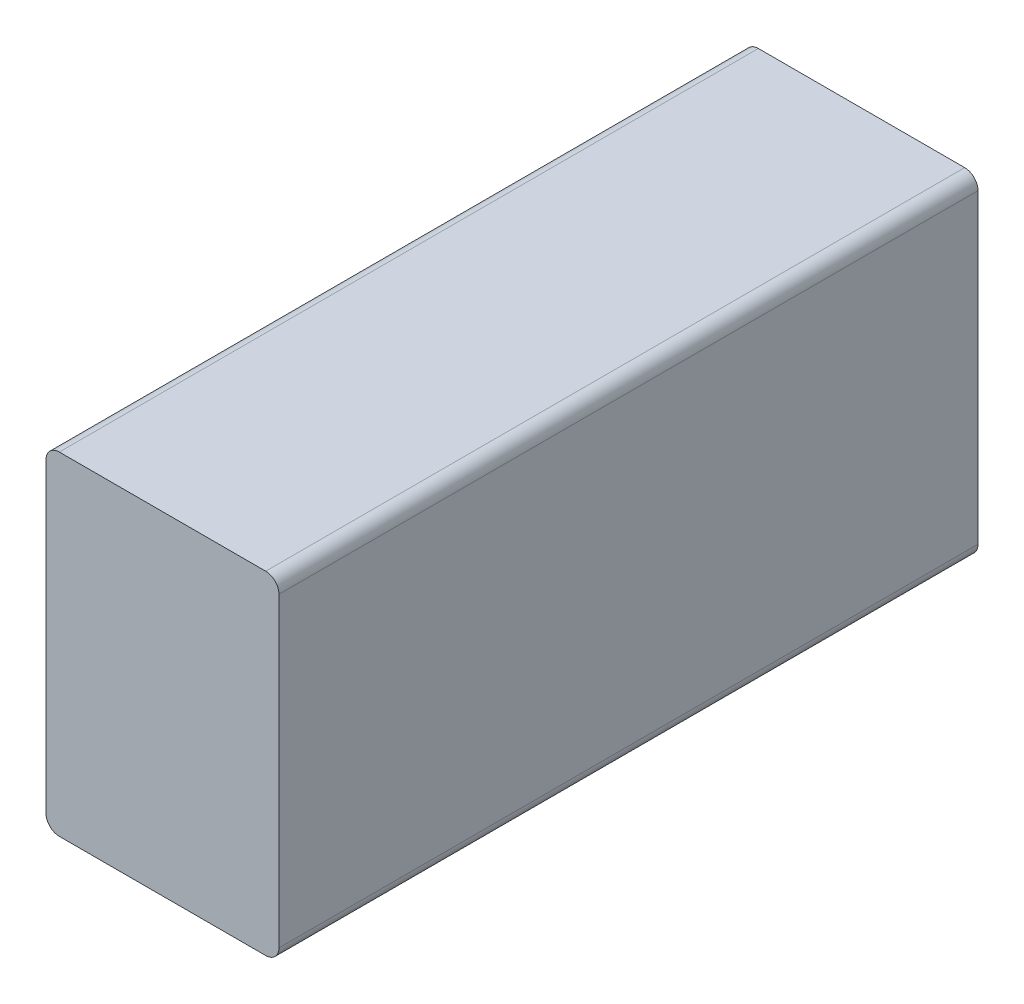
ISO-10303-21;
HEADER;
FILE_DESCRIPTION(('STEP AP214'),'2;1');
FILE_NAME('part.step','',(''),(''),'','','');
FILE_SCHEMA(('AUTOMOTIVE_DESIGN { 1 0 10303 214 1 1 1 1 }'));
ENDSEC;
DATA;
#1=APPLICATION_CONTEXT('core data for automotive mechanical design processes');
#2=APPLICATION_PROTOCOL_DEFINITION('international standard','automotive_design',2000,#1);
#3=PRODUCT_CONTEXT('',#1,'mechanical');
#4=PRODUCT('Part','Part','',(#3));
#5=PRODUCT_RELATED_PRODUCT_CATEGORY('part','',(#4));
#6=PRODUCT_DEFINITION_FORMATION('','',#4);
#7=PRODUCT_DEFINITION_CONTEXT('part definition',#1,'design');
#8=PRODUCT_DEFINITION('design','',#6,#7);
#9=PRODUCT_DEFINITION_SHAPE('','',#8);
#10=(LENGTH_UNIT() NAMED_UNIT(*) SI_UNIT(.MILLI.,.METRE.));
#11=(NAMED_UNIT(*) PLANE_ANGLE_UNIT() SI_UNIT($,.RADIAN.));
#12=(NAMED_UNIT(*) SI_UNIT($,.STERADIAN.) SOLID_ANGLE_UNIT());
#13=UNCERTAINTY_MEASURE_WITH_UNIT(LENGTH_MEASURE(1.E-05),#10,'distance_accuracy_value','');
#14=(GEOMETRIC_REPRESENTATION_CONTEXT(3) GLOBAL_UNCERTAINTY_ASSIGNED_CONTEXT((#13)) GLOBAL_UNIT_ASSIGNED_CONTEXT((#10,
#11,#12)) REPRESENTATION_CONTEXT('',''));
#15=CARTESIAN_POINT('',(0.,0.,0.));
#16=DIRECTION('',(0.,0.,1.));
#17=DIRECTION('',(1.,0.,0.));
#18=AXIS2_PLACEMENT_3D('',#15,#16,#17);
#19=CARTESIAN_POINT('',(17.5,-25.,105.));
#20=DIRECTION('',(-1.,0.,0.));
#21=DIRECTION('',(0.,0.,1.));
#22=AXIS2_PLACEMENT_3D('',#19,#20,#21);
#23=PLANE('',#22);
#24=DIRECTION('',(0.,1.,0.));
#25=VECTOR('',#24,1.);
#26=CARTESIAN_POINT('',(17.5,-25.,105.));
#27=LINE('',#26,#25);
#28=CARTESIAN_POINT('',(17.5,-23.,105.));
#29=VERTEX_POINT('',#28);
#30=CARTESIAN_POINT('',(17.5,23.,105.));
#31=VERTEX_POINT('',#30);
#32=EDGE_CURVE('E124',#29,#31,#27,.T.);
#33=ORIENTED_EDGE('',*,*,#32,.F.);
#34=DIRECTION('',(0.,0.,-1.));
#35=VECTOR('',#34,1.);
#36=CARTESIAN_POINT('',(17.5,-23.,105.));
#37=LINE('',#36,#35);
#38=CARTESIAN_POINT('',(17.5,-23.,0.));
#39=VERTEX_POINT('',#38);
#40=EDGE_CURVE('E150',#29,#39,#37,.T.);
#41=ORIENTED_EDGE('',*,*,#40,.T.);
#42=DIRECTION('',(0.,1.,0.));
#43=VECTOR('',#42,1.);
#44=CARTESIAN_POINT('',(17.5,-25.,0.));
#45=LINE('',#44,#43);
#46=CARTESIAN_POINT('',(17.5,23.,0.));
#47=VERTEX_POINT('',#46);
#48=EDGE_CURVE('E158',#39,#47,#45,.T.);
#49=ORIENTED_EDGE('',*,*,#48,.T.);
#50=DIRECTION('',(0.,0.,-1.));
#51=VECTOR('',#50,1.);
#52=CARTESIAN_POINT('',(17.5,23.,105.));
#53=LINE('',#52,#51);
#54=EDGE_CURVE('E148',#47,#31,#53,.F.);
#55=ORIENTED_EDGE('',*,*,#54,.T.);
#56=EDGE_LOOP('',(#33,#41,#49,#55));
#57=FACE_BOUND('',#56,.T.);
#58=ADVANCED_FACE('F33',(#57),#23,.F.);
#59=CARTESIAN_POINT('',(-17.5,25.,105.));
#60=DIRECTION('',(0.,-1.,0.));
#61=DIRECTION('',(0.,0.,-1.));
#62=AXIS2_PLACEMENT_3D('',#59,#60,#61);
#63=PLANE('',#62);
#64=DIRECTION('',(-1.,0.,0.));
#65=VECTOR('',#64,1.);
#66=CARTESIAN_POINT('',(-17.5,25.,0.));
#67=LINE('',#66,#65);
#68=CARTESIAN_POINT('',(15.5,25.,0.));
#69=VERTEX_POINT('',#68);
#70=CARTESIAN_POINT('',(-15.5,25.,0.));
#71=VERTEX_POINT('',#70);
#72=EDGE_CURVE('E129',#69,#71,#67,.T.);
#73=ORIENTED_EDGE('',*,*,#72,.T.);
#74=DIRECTION('',(0.,0.,-1.));
#75=VECTOR('',#74,1.);
#76=CARTESIAN_POINT('',(-15.5,25.,105.));
#77=LINE('',#76,#75);
#78=CARTESIAN_POINT('',(-15.5,25.,105.));
#79=VERTEX_POINT('',#78);
#80=EDGE_CURVE('E11',#71,#79,#77,.F.);
#81=ORIENTED_EDGE('',*,*,#80,.T.);
#82=DIRECTION('',(-1.,0.,0.));
#83=VECTOR('',#82,1.);
#84=CARTESIAN_POINT('',(-17.5,25.,105.));
#85=LINE('',#84,#83);
#86=CARTESIAN_POINT('',(15.5,25.,105.));
#87=VERTEX_POINT('',#86);
#88=EDGE_CURVE('E127',#87,#79,#85,.T.);
#89=ORIENTED_EDGE('',*,*,#88,.F.);
#90=DIRECTION('',(0.,0.,-1.));
#91=VECTOR('',#90,1.);
#92=CARTESIAN_POINT('',(15.5,25.,105.));
#93=LINE('',#92,#91);
#94=EDGE_CURVE('E41',#87,#69,#93,.T.);
#95=ORIENTED_EDGE('',*,*,#94,.T.);
#96=EDGE_LOOP('',(#73,#81,#89,#95));
#97=FACE_BOUND('',#96,.T.);
#98=ADVANCED_FACE('F155',(#97),#63,.F.);
#99=CARTESIAN_POINT('',(-17.5,-25.,105.));
#100=DIRECTION('',(1.,0.,0.));
#101=DIRECTION('',(0.,0.,-1.));
#102=AXIS2_PLACEMENT_3D('',#99,#100,#101);
#103=PLANE('',#102);
#104=DIRECTION('',(0.,-1.,0.));
#105=VECTOR('',#104,1.);
#106=CARTESIAN_POINT('',(-17.5,-25.,0.));
#107=LINE('',#106,#105);
#108=CARTESIAN_POINT('',(-17.5,23.,0.));
#109=VERTEX_POINT('',#108);
#110=CARTESIAN_POINT('',(-17.5,-23.,0.));
#111=VERTEX_POINT('',#110);
#112=EDGE_CURVE('E125',#109,#111,#107,.T.);
#113=ORIENTED_EDGE('',*,*,#112,.T.);
#114=DIRECTION('',(0.,0.,-1.));
#115=VECTOR('',#114,1.);
#116=CARTESIAN_POINT('',(-17.5,-23.,105.));
#117=LINE('',#116,#115);
#118=CARTESIAN_POINT('',(-17.5,-23.,105.));
#119=VERTEX_POINT('',#118);
#120=EDGE_CURVE('E103',#111,#119,#117,.F.);
#121=ORIENTED_EDGE('',*,*,#120,.T.);
#122=DIRECTION('',(0.,-1.,0.));
#123=VECTOR('',#122,1.);
#124=CARTESIAN_POINT('',(-17.5,-25.,105.));
#125=LINE('',#124,#123);
#126=CARTESIAN_POINT('',(-17.5,23.,105.));
#127=VERTEX_POINT('',#126);
#128=EDGE_CURVE('E162',#127,#119,#125,.T.);
#129=ORIENTED_EDGE('',*,*,#128,.F.);
#130=DIRECTION('',(0.,0.,-1.));
#131=VECTOR('',#130,1.);
#132=CARTESIAN_POINT('',(-17.5,23.,105.));
#133=LINE('',#132,#131);
#134=EDGE_CURVE('E108',#127,#109,#133,.T.);
#135=ORIENTED_EDGE('',*,*,#134,.T.);
#136=EDGE_LOOP('',(#113,#121,#129,#135));
#137=FACE_BOUND('',#136,.T.);
#138=ADVANCED_FACE('F172',(#137),#103,.F.);
#139=CARTESIAN_POINT('',(-17.5,-25.,105.));
#140=DIRECTION('',(0.,1.,0.));
#141=DIRECTION('',(0.,0.,1.));
#142=AXIS2_PLACEMENT_3D('',#139,#140,#141);
#143=PLANE('',#142);
#144=DIRECTION('',(1.,0.,0.));
#145=VECTOR('',#144,1.);
#146=CARTESIAN_POINT('',(-17.5,-25.,105.));
#147=LINE('',#146,#145);
#148=CARTESIAN_POINT('',(-15.5,-25.,105.));
#149=VERTEX_POINT('',#148);
#150=CARTESIAN_POINT('',(15.5,-25.,105.));
#151=VERTEX_POINT('',#150);
#152=EDGE_CURVE('E118',#149,#151,#147,.T.);
#153=ORIENTED_EDGE('',*,*,#152,.F.);
#154=DIRECTION('',(0.,0.,-1.));
#155=VECTOR('',#154,1.);
#156=CARTESIAN_POINT('',(-15.5,-25.,105.));
#157=LINE('',#156,#155);
#158=CARTESIAN_POINT('',(-15.5,-25.,0.));
#159=VERTEX_POINT('',#158);
#160=EDGE_CURVE('E102',#149,#159,#157,.T.);
#161=ORIENTED_EDGE('',*,*,#160,.T.);
#162=DIRECTION('',(1.,0.,0.));
#163=VECTOR('',#162,1.);
#164=CARTESIAN_POINT('',(-17.5,-25.,0.));
#165=LINE('',#164,#163);
#166=CARTESIAN_POINT('',(15.5,-25.,0.));
#167=VERTEX_POINT('',#166);
#168=EDGE_CURVE('E115',#159,#167,#165,.T.);
#169=ORIENTED_EDGE('',*,*,#168,.T.);
#170=DIRECTION('',(0.,0.,-1.));
#171=VECTOR('',#170,1.);
#172=CARTESIAN_POINT('',(15.5,-25.,105.));
#173=LINE('',#172,#171);
#174=EDGE_CURVE('E120',#167,#151,#173,.F.);
#175=ORIENTED_EDGE('',*,*,#174,.T.);
#176=EDGE_LOOP('',(#153,#161,#169,#175));
#177=FACE_BOUND('',#176,.T.);
#178=ADVANCED_FACE('F114',(#177),#143,.F.);
#179=CARTESIAN_POINT('',(0.,0.,105.));
#180=DIRECTION('',(0.,0.,-1.));
#181=DIRECTION('',(-1.,0.,0.));
#182=AXIS2_PLACEMENT_3D('',#179,#180,#181);
#183=PLANE('',#182);
#184=ORIENTED_EDGE('',*,*,#128,.T.);
#185=CARTESIAN_POINT('',(-15.5,-23.,105.));
#186=DIRECTION('',(0.,0.,-1.));
#187=DIRECTION('',(-1.,0.,0.));
#188=AXIS2_PLACEMENT_3D('',#185,#186,#187);
#189=CIRCLE('',#188,2.);
#190=EDGE_CURVE('E146',#119,#149,#189,.F.);
#191=ORIENTED_EDGE('',*,*,#190,.T.);
#192=ORIENTED_EDGE('',*,*,#152,.T.);
#193=CARTESIAN_POINT('',(15.5,-23.,105.));
#194=DIRECTION('',(0.,0.,-1.));
#195=DIRECTION('',(-1.,0.,0.));
#196=AXIS2_PLACEMENT_3D('',#193,#194,#195);
#197=CIRCLE('',#196,2.);
#198=EDGE_CURVE('E144',#151,#29,#197,.F.);
#199=ORIENTED_EDGE('',*,*,#198,.T.);
#200=ORIENTED_EDGE('',*,*,#32,.T.);
#201=CARTESIAN_POINT('',(15.5,23.,105.));
#202=DIRECTION('',(0.,0.,-1.));
#203=DIRECTION('',(-1.,0.,0.));
#204=AXIS2_PLACEMENT_3D('',#201,#202,#203);
#205=CIRCLE('',#204,2.);
#206=EDGE_CURVE('E53',#31,#87,#205,.F.);
#207=ORIENTED_EDGE('',*,*,#206,.T.);
#208=ORIENTED_EDGE('',*,*,#88,.T.);
#209=CARTESIAN_POINT('',(-15.5,23.,105.));
#210=DIRECTION('',(0.,0.,-1.));
#211=DIRECTION('',(-1.,0.,0.));
#212=AXIS2_PLACEMENT_3D('',#209,#210,#211);
#213=CIRCLE('',#212,2.);
#214=EDGE_CURVE('E142',#79,#127,#213,.F.);
#215=ORIENTED_EDGE('',*,*,#214,.T.);
#216=EDGE_LOOP('',(#184,#191,#192,#199,#200,#207,#208,#215));
#217=FACE_BOUND('',#216,.T.);
#218=ADVANCED_FACE('F166',(#217),#183,.F.);
#219=CARTESIAN_POINT('',(0.,0.,0.));
#220=DIRECTION('',(0.,0.,-1.));
#221=DIRECTION('',(-1.,0.,0.));
#222=AXIS2_PLACEMENT_3D('',#219,#220,#221);
#223=PLANE('',#222);
#224=ORIENTED_EDGE('',*,*,#168,.F.);
#225=CARTESIAN_POINT('',(-15.5,-23.,0.));
#226=DIRECTION('',(0.,0.,-1.));
#227=DIRECTION('',(-1.,0.,0.));
#228=AXIS2_PLACEMENT_3D('',#225,#226,#227);
#229=CIRCLE('',#228,2.);
#230=EDGE_CURVE('E98',#159,#111,#229,.T.);
#231=ORIENTED_EDGE('',*,*,#230,.T.);
#232=ORIENTED_EDGE('',*,*,#112,.F.);
#233=CARTESIAN_POINT('',(-15.5,23.,0.));
#234=DIRECTION('',(0.,0.,-1.));
#235=DIRECTION('',(-1.,0.,0.));
#236=AXIS2_PLACEMENT_3D('',#233,#234,#235);
#237=CIRCLE('',#236,2.);
#238=EDGE_CURVE('E135',#109,#71,#237,.T.);
#239=ORIENTED_EDGE('',*,*,#238,.T.);
#240=ORIENTED_EDGE('',*,*,#72,.F.);
#241=CARTESIAN_POINT('',(15.5,23.,0.));
#242=DIRECTION('',(0.,0.,-1.));
#243=DIRECTION('',(-1.,0.,0.));
#244=AXIS2_PLACEMENT_3D('',#241,#242,#243);
#245=CIRCLE('',#244,2.);
#246=EDGE_CURVE('E119',#69,#47,#245,.T.);
#247=ORIENTED_EDGE('',*,*,#246,.T.);
#248=ORIENTED_EDGE('',*,*,#48,.F.);
#249=CARTESIAN_POINT('',(15.5,-23.,0.));
#250=DIRECTION('',(0.,0.,-1.));
#251=DIRECTION('',(-1.,0.,0.));
#252=AXIS2_PLACEMENT_3D('',#249,#250,#251);
#253=CIRCLE('',#252,2.);
#254=EDGE_CURVE('E109',#39,#167,#253,.T.);
#255=ORIENTED_EDGE('',*,*,#254,.T.);
#256=EDGE_LOOP('',(#224,#231,#232,#239,#240,#247,#248,#255));
#257=FACE_BOUND('',#256,.T.);
#258=ADVANCED_FACE('F122',(#257),#223,.T.);
#259=CARTESIAN_POINT('',(-15.5,-23.,105.));
#260=DIRECTION('',(0.,0.,-1.));
#261=DIRECTION('',(-1.,0.,0.));
#262=AXIS2_PLACEMENT_3D('',#259,#260,#261);
#263=CYLINDRICAL_SURFACE('',#262,2.);
#264=ORIENTED_EDGE('',*,*,#190,.F.);
#265=ORIENTED_EDGE('',*,*,#120,.F.);
#266=ORIENTED_EDGE('',*,*,#230,.F.);
#267=ORIENTED_EDGE('',*,*,#160,.F.);
#268=EDGE_LOOP('',(#264,#265,#266,#267));
#269=FACE_BOUND('',#268,.T.);
#270=ADVANCED_FACE('F101',(#269),#263,.T.);
#271=CARTESIAN_POINT('',(15.5,-23.,105.));
#272=DIRECTION('',(0.,0.,-1.));
#273=DIRECTION('',(-1.,0.,0.));
#274=AXIS2_PLACEMENT_3D('',#271,#272,#273);
#275=CYLINDRICAL_SURFACE('',#274,2.);
#276=ORIENTED_EDGE('',*,*,#198,.F.);
#277=ORIENTED_EDGE('',*,*,#174,.F.);
#278=ORIENTED_EDGE('',*,*,#254,.F.);
#279=ORIENTED_EDGE('',*,*,#40,.F.);
#280=EDGE_LOOP('',(#276,#277,#278,#279));
#281=FACE_BOUND('',#280,.T.);
#282=ADVANCED_FACE('F177',(#281),#275,.T.);
#283=CARTESIAN_POINT('',(-15.5,23.,105.));
#284=DIRECTION('',(0.,0.,-1.));
#285=DIRECTION('',(-1.,0.,0.));
#286=AXIS2_PLACEMENT_3D('',#283,#284,#285);
#287=CYLINDRICAL_SURFACE('',#286,2.);
#288=ORIENTED_EDGE('',*,*,#214,.F.);
#289=ORIENTED_EDGE('',*,*,#80,.F.);
#290=ORIENTED_EDGE('',*,*,#238,.F.);
#291=ORIENTED_EDGE('',*,*,#134,.F.);
#292=EDGE_LOOP('',(#288,#289,#290,#291));
#293=FACE_BOUND('',#292,.T.);
#294=ADVANCED_FACE('F170',(#293),#287,.T.);
#295=CARTESIAN_POINT('',(15.5,23.,105.));
#296=DIRECTION('',(0.,0.,-1.));
#297=DIRECTION('',(-1.,0.,0.));
#298=AXIS2_PLACEMENT_3D('',#295,#296,#297);
#299=CYLINDRICAL_SURFACE('',#298,2.);
#300=ORIENTED_EDGE('',*,*,#206,.F.);
#301=ORIENTED_EDGE('',*,*,#54,.F.);
#302=ORIENTED_EDGE('',*,*,#246,.F.);
#303=ORIENTED_EDGE('',*,*,#94,.F.);
#304=EDGE_LOOP('',(#300,#301,#302,#303));
#305=FACE_BOUND('',#304,.T.);
#306=ADVANCED_FACE('F35',(#305),#299,.T.);
#307=CLOSED_SHELL('',(#58,#98,#138,#178,#218,#258,#270,#282,#294,#306));
#308=MANIFOLD_SOLID_BREP('B2',#307);
#309=ADVANCED_BREP_SHAPE_REPRESENTATION('',(#18,#308),#14);
#310=SHAPE_DEFINITION_REPRESENTATION(#9,#309);
ENDSEC;
END-ISO-10303-21;
